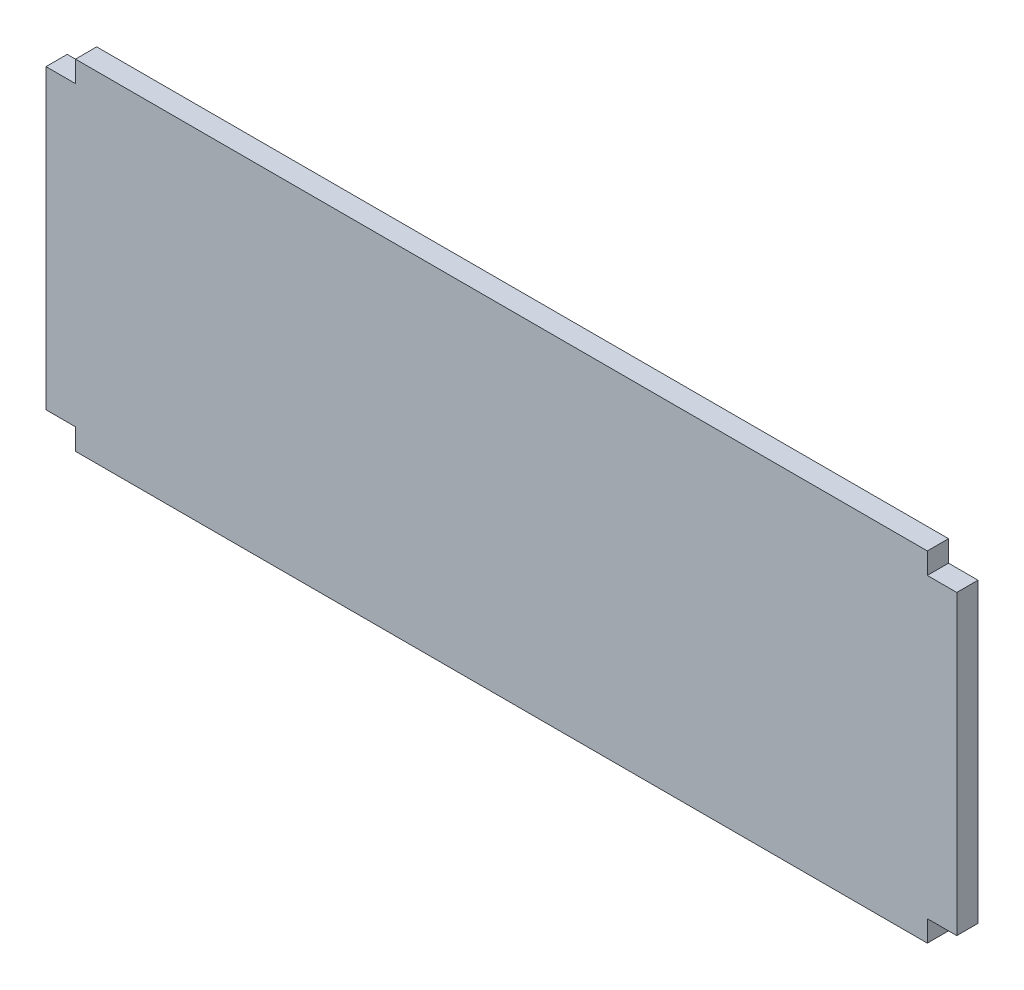
ISO-10303-21;
HEADER;
FILE_DESCRIPTION(('STEP AP214'),'2;1');
FILE_NAME('part.step','',(''),(''),'','','');
FILE_SCHEMA(('AUTOMOTIVE_DESIGN { 1 0 10303 214 1 1 1 1 }'));
ENDSEC;
DATA;
#1=APPLICATION_CONTEXT('core data for automotive mechanical design processes');
#2=APPLICATION_PROTOCOL_DEFINITION('international standard','automotive_design',2000,#1);
#3=PRODUCT_CONTEXT('',#1,'mechanical');
#4=PRODUCT('Part','Part','',(#3));
#5=PRODUCT_RELATED_PRODUCT_CATEGORY('part','',(#4));
#6=PRODUCT_DEFINITION_FORMATION('','',#4);
#7=PRODUCT_DEFINITION_CONTEXT('part definition',#1,'design');
#8=PRODUCT_DEFINITION('design','',#6,#7);
#9=PRODUCT_DEFINITION_SHAPE('','',#8);
#10=(LENGTH_UNIT() NAMED_UNIT(*) SI_UNIT(.MILLI.,.METRE.));
#11=(NAMED_UNIT(*) PLANE_ANGLE_UNIT() SI_UNIT($,.RADIAN.));
#12=(NAMED_UNIT(*) SI_UNIT($,.STERADIAN.) SOLID_ANGLE_UNIT());
#13=UNCERTAINTY_MEASURE_WITH_UNIT(LENGTH_MEASURE(1.E-05),#10,'distance_accuracy_value','');
#14=(GEOMETRIC_REPRESENTATION_CONTEXT(3) GLOBAL_UNCERTAINTY_ASSIGNED_CONTEXT((#13)) GLOBAL_UNIT_ASSIGNED_CONTEXT((#10,
#11,#12)) REPRESENTATION_CONTEXT('',''));
#15=CARTESIAN_POINT('',(0.,0.,0.));
#16=DIRECTION('',(0.,0.,1.));
#17=DIRECTION('',(1.,0.,0.));
#18=AXIS2_PLACEMENT_3D('',#15,#16,#17);
#19=CARTESIAN_POINT('',(49.4442360253456,120.991666867358,5.08));
#20=DIRECTION('',(1.,0.,0.));
#21=DIRECTION('',(0.,0.,-1.));
#22=AXIS2_PLACEMENT_3D('',#19,#20,#21);
#23=PLANE('',#22);
#24=DIRECTION('',(0.,-1.,0.));
#25=VECTOR('',#24,1.);
#26=CARTESIAN_POINT('',(49.4442360253456,120.991666867358,0.));
#27=LINE('',#26,#25);
#28=CARTESIAN_POINT('',(49.4442360253456,120.991666867358,0.));
#29=VERTEX_POINT('',#28);
#30=CARTESIAN_POINT('',(49.4442360253456,115.911666867358,0.));
#31=VERTEX_POINT('',#30);
#32=EDGE_CURVE('E153',#29,#31,#27,.T.);
#33=ORIENTED_EDGE('',*,*,#32,.T.);
#34=DIRECTION('',(0.,0.,-1.));
#35=VECTOR('',#34,1.);
#36=CARTESIAN_POINT('',(49.4442360253456,115.911666867358,5.08));
#37=LINE('',#36,#35);
#38=CARTESIAN_POINT('',(49.4442360253456,115.911666867358,5.08));
#39=VERTEX_POINT('',#38);
#40=EDGE_CURVE('E11',#39,#31,#37,.T.);
#41=ORIENTED_EDGE('',*,*,#40,.F.);
#42=DIRECTION('',(0.,-1.,0.));
#43=VECTOR('',#42,1.);
#44=CARTESIAN_POINT('',(49.4442360253456,120.991666867358,5.08));
#45=LINE('',#44,#43);
#46=CARTESIAN_POINT('',(49.4442360253456,120.991666867358,5.08));
#47=VERTEX_POINT('',#46);
#48=EDGE_CURVE('E183',#47,#39,#45,.T.);
#49=ORIENTED_EDGE('',*,*,#48,.F.);
#50=DIRECTION('',(0.,0.,-1.));
#51=VECTOR('',#50,1.);
#52=CARTESIAN_POINT('',(49.4442360253456,120.991666867358,5.08));
#53=LINE('',#52,#51);
#54=EDGE_CURVE('E49',#47,#29,#53,.T.);
#55=ORIENTED_EDGE('',*,*,#54,.T.);
#56=EDGE_LOOP('',(#33,#41,#49,#55));
#57=FACE_BOUND('',#56,.T.);
#58=ADVANCED_FACE('F33',(#57),#23,.F.);
#59=CARTESIAN_POINT('',(49.4442360253456,115.911666867358,5.08));
#60=DIRECTION('',(0.,-1.,0.));
#61=DIRECTION('',(0.,0.,-1.));
#62=AXIS2_PLACEMENT_3D('',#59,#60,#61);
#63=PLANE('',#62);
#64=DIRECTION('',(-1.,0.,0.));
#65=VECTOR('',#64,1.);
#66=CARTESIAN_POINT('',(49.4442360253456,115.911666867358,0.));
#67=LINE('',#66,#65);
#68=CARTESIAN_POINT('',(42.3963105306768,115.911666867358,0.));
#69=VERTEX_POINT('',#68);
#70=EDGE_CURVE('E155',#31,#69,#67,.T.);
#71=ORIENTED_EDGE('',*,*,#70,.T.);
#72=DIRECTION('',(0.,0.,-1.));
#73=VECTOR('',#72,1.);
#74=CARTESIAN_POINT('',(42.3963105306768,115.911666867358,5.08));
#75=LINE('',#74,#73);
#76=CARTESIAN_POINT('',(42.3963105306768,115.911666867358,5.08));
#77=VERTEX_POINT('',#76);
#78=EDGE_CURVE('E41',#77,#69,#75,.T.);
#79=ORIENTED_EDGE('',*,*,#78,.F.);
#80=DIRECTION('',(-1.,0.,0.));
#81=VECTOR('',#80,1.);
#82=CARTESIAN_POINT('',(49.4442360253456,115.911666867358,5.08));
#83=LINE('',#82,#81);
#84=EDGE_CURVE('E99',#39,#77,#83,.T.);
#85=ORIENTED_EDGE('',*,*,#84,.F.);
#86=ORIENTED_EDGE('',*,*,#40,.T.);
#87=EDGE_LOOP('',(#71,#79,#85,#86));
#88=FACE_BOUND('',#87,.T.);
#89=ADVANCED_FACE('F245',(#88),#63,.F.);
#90=CARTESIAN_POINT('',(42.3963105306768,115.911666867358,5.08));
#91=DIRECTION('',(1.,0.,0.));
#92=DIRECTION('',(0.,0.,-1.));
#93=AXIS2_PLACEMENT_3D('',#90,#91,#92);
#94=PLANE('',#93);
#95=DIRECTION('',(0.,-1.,0.));
#96=VECTOR('',#95,1.);
#97=CARTESIAN_POINT('',(42.3963105306768,115.911666867358,0.));
#98=LINE('',#97,#96);
#99=CARTESIAN_POINT('',(42.3963105306768,44.7916668673583,0.));
#100=VERTEX_POINT('',#99);
#101=EDGE_CURVE('E157',#69,#100,#98,.T.);
#102=ORIENTED_EDGE('',*,*,#101,.T.);
#103=DIRECTION('',(0.,0.,-1.));
#104=VECTOR('',#103,1.);
#105=CARTESIAN_POINT('',(42.3963105306768,44.7916668673583,5.08));
#106=LINE('',#105,#104);
#107=CARTESIAN_POINT('',(42.3963105306768,44.7916668673583,5.08));
#108=VERTEX_POINT('',#107);
#109=EDGE_CURVE('E198',#108,#100,#106,.T.);
#110=ORIENTED_EDGE('',*,*,#109,.F.);
#111=DIRECTION('',(0.,-1.,0.));
#112=VECTOR('',#111,1.);
#113=CARTESIAN_POINT('',(42.3963105306768,115.911666867358,5.08));
#114=LINE('',#113,#112);
#115=EDGE_CURVE('E205',#77,#108,#114,.T.);
#116=ORIENTED_EDGE('',*,*,#115,.F.);
#117=ORIENTED_EDGE('',*,*,#78,.T.);
#118=EDGE_LOOP('',(#102,#110,#116,#117));
#119=FACE_BOUND('',#118,.T.);
#120=ADVANCED_FACE('F203',(#119),#94,.F.);
#121=CARTESIAN_POINT('',(49.4442360253456,44.7916668673583,5.08));
#122=DIRECTION('',(0.,-1.,0.));
#123=DIRECTION('',(0.,0.,-1.));
#124=AXIS2_PLACEMENT_3D('',#121,#122,#123);
#125=PLANE('',#124);
#126=DIRECTION('',(-1.,0.,0.));
#127=VECTOR('',#126,1.);
#128=CARTESIAN_POINT('',(49.4442360253456,44.7916668673583,0.));
#129=LINE('',#128,#127);
#130=CARTESIAN_POINT('',(49.4442360253456,44.7916668673583,0.));
#131=VERTEX_POINT('',#130);
#132=EDGE_CURVE('E160',#131,#100,#129,.T.);
#133=ORIENTED_EDGE('',*,*,#132,.F.);
#134=DIRECTION('',(0.,0.,-1.));
#135=VECTOR('',#134,1.);
#136=CARTESIAN_POINT('',(49.4442360253456,44.7916668673583,5.08));
#137=LINE('',#136,#135);
#138=CARTESIAN_POINT('',(49.4442360253456,44.7916668673583,5.08));
#139=VERTEX_POINT('',#138);
#140=EDGE_CURVE('E196',#139,#131,#137,.T.);
#141=ORIENTED_EDGE('',*,*,#140,.F.);
#142=DIRECTION('',(-1.,0.,0.));
#143=VECTOR('',#142,1.);
#144=CARTESIAN_POINT('',(49.4442360253456,44.7916668673583,5.08));
#145=LINE('',#144,#143);
#146=EDGE_CURVE('E216',#139,#108,#145,.T.);
#147=ORIENTED_EDGE('',*,*,#146,.T.);
#148=ORIENTED_EDGE('',*,*,#109,.T.);
#149=EDGE_LOOP('',(#133,#141,#147,#148));
#150=FACE_BOUND('',#149,.T.);
#151=ADVANCED_FACE('F212',(#150),#125,.T.);
#152=CARTESIAN_POINT('',(49.4442360253456,44.7916668673583,5.08));
#153=DIRECTION('',(1.,0.,0.));
#154=DIRECTION('',(0.,0.,-1.));
#155=AXIS2_PLACEMENT_3D('',#152,#153,#154);
#156=PLANE('',#155);
#157=DIRECTION('',(0.,-1.,0.));
#158=VECTOR('',#157,1.);
#159=CARTESIAN_POINT('',(49.4442360253456,44.7916668673583,0.));
#160=LINE('',#159,#158);
#161=CARTESIAN_POINT('',(49.4442360253456,39.7116668673583,0.));
#162=VERTEX_POINT('',#161);
#163=EDGE_CURVE('E163',#131,#162,#160,.T.);
#164=ORIENTED_EDGE('',*,*,#163,.T.);
#165=DIRECTION('',(0.,0.,-1.));
#166=VECTOR('',#165,1.);
#167=CARTESIAN_POINT('',(49.4442360253456,39.7116668673583,5.08));
#168=LINE('',#167,#166);
#169=CARTESIAN_POINT('',(49.4442360253456,39.7116668673583,5.08));
#170=VERTEX_POINT('',#169);
#171=EDGE_CURVE('E193',#170,#162,#168,.T.);
#172=ORIENTED_EDGE('',*,*,#171,.F.);
#173=DIRECTION('',(0.,-1.,0.));
#174=VECTOR('',#173,1.);
#175=CARTESIAN_POINT('',(49.4442360253456,44.7916668673583,5.08));
#176=LINE('',#175,#174);
#177=EDGE_CURVE('E217',#139,#170,#176,.T.);
#178=ORIENTED_EDGE('',*,*,#177,.F.);
#179=ORIENTED_EDGE('',*,*,#140,.T.);
#180=EDGE_LOOP('',(#164,#172,#178,#179));
#181=FACE_BOUND('',#180,.T.);
#182=ADVANCED_FACE('F258',(#181),#156,.F.);
#183=CARTESIAN_POINT('',(49.4442360253456,39.7116668673583,5.08));
#184=DIRECTION('',(0.,1.,0.));
#185=DIRECTION('',(0.,0.,1.));
#186=AXIS2_PLACEMENT_3D('',#183,#184,#185);
#187=PLANE('',#186);
#188=DIRECTION('',(1.,0.,0.));
#189=VECTOR('',#188,1.);
#190=CARTESIAN_POINT('',(49.4442360253456,39.7116668673583,0.));
#191=LINE('',#190,#189);
#192=CARTESIAN_POINT('',(253.279004245575,39.7116668673583,0.));
#193=VERTEX_POINT('',#192);
#194=EDGE_CURVE('E165',#162,#193,#191,.T.);
#195=ORIENTED_EDGE('',*,*,#194,.T.);
#196=DIRECTION('',(0.,0.,-1.));
#197=VECTOR('',#196,1.);
#198=CARTESIAN_POINT('',(253.279004245575,39.7116668673583,5.08));
#199=LINE('',#198,#197);
#200=CARTESIAN_POINT('',(253.279004245575,39.7116668673583,5.08));
#201=VERTEX_POINT('',#200);
#202=EDGE_CURVE('E191',#201,#193,#199,.T.);
#203=ORIENTED_EDGE('',*,*,#202,.F.);
#204=DIRECTION('',(1.,0.,0.));
#205=VECTOR('',#204,1.);
#206=CARTESIAN_POINT('',(49.4442360253456,39.7116668673583,5.08));
#207=LINE('',#206,#205);
#208=EDGE_CURVE('E219',#170,#201,#207,.T.);
#209=ORIENTED_EDGE('',*,*,#208,.F.);
#210=ORIENTED_EDGE('',*,*,#171,.T.);
#211=EDGE_LOOP('',(#195,#203,#209,#210));
#212=FACE_BOUND('',#211,.T.);
#213=ADVANCED_FACE('F261',(#212),#187,.F.);
#214=CARTESIAN_POINT('',(253.279004245575,44.7916668673583,5.08));
#215=DIRECTION('',(1.,0.,0.));
#216=DIRECTION('',(0.,0.,-1.));
#217=AXIS2_PLACEMENT_3D('',#214,#215,#216);
#218=PLANE('',#217);
#219=DIRECTION('',(0.,-1.,0.));
#220=VECTOR('',#219,1.);
#221=CARTESIAN_POINT('',(253.279004245575,44.7916668673583,0.));
#222=LINE('',#221,#220);
#223=CARTESIAN_POINT('',(253.279004245575,44.7916668673583,0.));
#224=VERTEX_POINT('',#223);
#225=EDGE_CURVE('E168',#224,#193,#222,.T.);
#226=ORIENTED_EDGE('',*,*,#225,.F.);
#227=DIRECTION('',(0.,0.,-1.));
#228=VECTOR('',#227,1.);
#229=CARTESIAN_POINT('',(253.279004245575,44.7916668673583,5.08));
#230=LINE('',#229,#228);
#231=CARTESIAN_POINT('',(253.279004245575,44.7916668673583,5.08));
#232=VERTEX_POINT('',#231);
#233=EDGE_CURVE('E189',#232,#224,#230,.T.);
#234=ORIENTED_EDGE('',*,*,#233,.F.);
#235=DIRECTION('',(0.,-1.,0.));
#236=VECTOR('',#235,1.);
#237=CARTESIAN_POINT('',(253.279004245575,44.7916668673583,5.08));
#238=LINE('',#237,#236);
#239=EDGE_CURVE('E225',#232,#201,#238,.T.);
#240=ORIENTED_EDGE('',*,*,#239,.T.);
#241=ORIENTED_EDGE('',*,*,#202,.T.);
#242=EDGE_LOOP('',(#226,#234,#240,#241));
#243=FACE_BOUND('',#242,.T.);
#244=ADVANCED_FACE('F265',(#243),#218,.T.);
#245=CARTESIAN_POINT('',(253.279004245575,44.7916668673583,5.08));
#246=DIRECTION('',(0.,1.,0.));
#247=DIRECTION('',(0.,0.,1.));
#248=AXIS2_PLACEMENT_3D('',#245,#246,#247);
#249=PLANE('',#248);
#250=DIRECTION('',(1.,0.,0.));
#251=VECTOR('',#250,1.);
#252=CARTESIAN_POINT('',(253.279004245575,44.7916668673583,0.));
#253=LINE('',#252,#251);
#254=CARTESIAN_POINT('',(260.326929740244,44.7916668673583,0.));
#255=VERTEX_POINT('',#254);
#256=EDGE_CURVE('E171',#224,#255,#253,.T.);
#257=ORIENTED_EDGE('',*,*,#256,.T.);
#258=DIRECTION('',(0.,0.,-1.));
#259=VECTOR('',#258,1.);
#260=CARTESIAN_POINT('',(260.326929740244,44.7916668673583,5.08));
#261=LINE('',#260,#259);
#262=CARTESIAN_POINT('',(260.326929740244,44.7916668673583,5.08));
#263=VERTEX_POINT('',#262);
#264=EDGE_CURVE('E187',#263,#255,#261,.T.);
#265=ORIENTED_EDGE('',*,*,#264,.F.);
#266=DIRECTION('',(1.,0.,0.));
#267=VECTOR('',#266,1.);
#268=CARTESIAN_POINT('',(253.279004245575,44.7916668673583,5.08));
#269=LINE('',#268,#267);
#270=EDGE_CURVE('E228',#232,#263,#269,.T.);
#271=ORIENTED_EDGE('',*,*,#270,.F.);
#272=ORIENTED_EDGE('',*,*,#233,.T.);
#273=EDGE_LOOP('',(#257,#265,#271,#272));
#274=FACE_BOUND('',#273,.T.);
#275=ADVANCED_FACE('F269',(#274),#249,.F.);
#276=CARTESIAN_POINT('',(260.326929740244,115.911666867358,5.08));
#277=DIRECTION('',(1.,0.,0.));
#278=DIRECTION('',(0.,0.,-1.));
#279=AXIS2_PLACEMENT_3D('',#276,#277,#278);
#280=PLANE('',#279);
#281=DIRECTION('',(0.,-1.,0.));
#282=VECTOR('',#281,1.);
#283=CARTESIAN_POINT('',(260.326929740244,115.911666867358,0.));
#284=LINE('',#283,#282);
#285=CARTESIAN_POINT('',(260.326929740244,115.911666867358,0.));
#286=VERTEX_POINT('',#285);
#287=EDGE_CURVE('E174',#286,#255,#284,.T.);
#288=ORIENTED_EDGE('',*,*,#287,.F.);
#289=DIRECTION('',(0.,0.,-1.));
#290=VECTOR('',#289,1.);
#291=CARTESIAN_POINT('',(260.326929740244,115.911666867358,5.08));
#292=LINE('',#291,#290);
#293=CARTESIAN_POINT('',(260.326929740244,115.911666867358,5.08));
#294=VERTEX_POINT('',#293);
#295=EDGE_CURVE('E136',#294,#286,#292,.T.);
#296=ORIENTED_EDGE('',*,*,#295,.F.);
#297=DIRECTION('',(0.,-1.,0.));
#298=VECTOR('',#297,1.);
#299=CARTESIAN_POINT('',(260.326929740244,115.911666867358,5.08));
#300=LINE('',#299,#298);
#301=EDGE_CURVE('E145',#294,#263,#300,.T.);
#302=ORIENTED_EDGE('',*,*,#301,.T.);
#303=ORIENTED_EDGE('',*,*,#264,.T.);
#304=EDGE_LOOP('',(#288,#296,#302,#303));
#305=FACE_BOUND('',#304,.T.);
#306=ADVANCED_FACE('F231',(#305),#280,.T.);
#307=CARTESIAN_POINT('',(253.279004245575,115.911666867358,5.08));
#308=DIRECTION('',(0.,1.,0.));
#309=DIRECTION('',(0.,0.,1.));
#310=AXIS2_PLACEMENT_3D('',#307,#308,#309);
#311=PLANE('',#310);
#312=DIRECTION('',(1.,0.,0.));
#313=VECTOR('',#312,1.);
#314=CARTESIAN_POINT('',(253.279004245575,115.911666867358,0.));
#315=LINE('',#314,#313);
#316=CARTESIAN_POINT('',(253.279004245575,115.911666867358,0.));
#317=VERTEX_POINT('',#316);
#318=EDGE_CURVE('E132',#317,#286,#315,.T.);
#319=ORIENTED_EDGE('',*,*,#318,.F.);
#320=DIRECTION('',(0.,0.,-1.));
#321=VECTOR('',#320,1.);
#322=CARTESIAN_POINT('',(253.279004245575,115.911666867358,5.08));
#323=LINE('',#322,#321);
#324=CARTESIAN_POINT('',(253.279004245575,115.911666867358,5.08));
#325=VERTEX_POINT('',#324);
#326=EDGE_CURVE('E127',#325,#317,#323,.T.);
#327=ORIENTED_EDGE('',*,*,#326,.F.);
#328=DIRECTION('',(1.,0.,0.));
#329=VECTOR('',#328,1.);
#330=CARTESIAN_POINT('',(253.279004245575,115.911666867358,5.08));
#331=LINE('',#330,#329);
#332=EDGE_CURVE('E130',#325,#294,#331,.T.);
#333=ORIENTED_EDGE('',*,*,#332,.T.);
#334=ORIENTED_EDGE('',*,*,#295,.T.);
#335=EDGE_LOOP('',(#319,#327,#333,#334));
#336=FACE_BOUND('',#335,.T.);
#337=ADVANCED_FACE('F129',(#336),#311,.T.);
#338=CARTESIAN_POINT('',(253.279004245575,120.991666867358,5.08));
#339=DIRECTION('',(1.,0.,0.));
#340=DIRECTION('',(0.,0.,-1.));
#341=AXIS2_PLACEMENT_3D('',#338,#339,#340);
#342=PLANE('',#341);
#343=DIRECTION('',(0.,-1.,0.));
#344=VECTOR('',#343,1.);
#345=CARTESIAN_POINT('',(253.279004245575,120.991666867358,0.));
#346=LINE('',#345,#344);
#347=CARTESIAN_POINT('',(253.279004245575,120.991666867358,0.));
#348=VERTEX_POINT('',#347);
#349=EDGE_CURVE('E178',#348,#317,#346,.T.);
#350=ORIENTED_EDGE('',*,*,#349,.F.);
#351=DIRECTION('',(0.,0.,-1.));
#352=VECTOR('',#351,1.);
#353=CARTESIAN_POINT('',(253.279004245575,120.991666867358,5.08));
#354=LINE('',#353,#352);
#355=CARTESIAN_POINT('',(253.279004245575,120.991666867358,5.08));
#356=VERTEX_POINT('',#355);
#357=EDGE_CURVE('E87',#356,#348,#354,.T.);
#358=ORIENTED_EDGE('',*,*,#357,.F.);
#359=DIRECTION('',(0.,-1.,0.));
#360=VECTOR('',#359,1.);
#361=CARTESIAN_POINT('',(253.279004245575,120.991666867358,5.08));
#362=LINE('',#361,#360);
#363=EDGE_CURVE('E143',#356,#325,#362,.T.);
#364=ORIENTED_EDGE('',*,*,#363,.T.);
#365=ORIENTED_EDGE('',*,*,#326,.T.);
#366=EDGE_LOOP('',(#350,#358,#364,#365));
#367=FACE_BOUND('',#366,.T.);
#368=ADVANCED_FACE('F147',(#367),#342,.T.);
#369=CARTESIAN_POINT('',(49.4442360253456,120.991666867358,5.08));
#370=DIRECTION('',(0.,1.,0.));
#371=DIRECTION('',(0.,0.,1.));
#372=AXIS2_PLACEMENT_3D('',#369,#370,#371);
#373=PLANE('',#372);
#374=DIRECTION('',(1.,0.,0.));
#375=VECTOR('',#374,1.);
#376=CARTESIAN_POINT('',(49.4442360253456,120.991666867358,0.));
#377=LINE('',#376,#375);
#378=EDGE_CURVE('E180',#29,#348,#377,.T.);
#379=ORIENTED_EDGE('',*,*,#378,.F.);
#380=ORIENTED_EDGE('',*,*,#54,.F.);
#381=DIRECTION('',(1.,0.,0.));
#382=VECTOR('',#381,1.);
#383=CARTESIAN_POINT('',(49.4442360253456,120.991666867358,5.08));
#384=LINE('',#383,#382);
#385=EDGE_CURVE('E148',#47,#356,#384,.T.);
#386=ORIENTED_EDGE('',*,*,#385,.T.);
#387=ORIENTED_EDGE('',*,*,#357,.T.);
#388=EDGE_LOOP('',(#379,#380,#386,#387));
#389=FACE_BOUND('',#388,.T.);
#390=ADVANCED_FACE('F234',(#389),#373,.T.);
#391=CARTESIAN_POINT('',(0.,0.,5.08));
#392=DIRECTION('',(0.,0.,-1.));
#393=DIRECTION('',(-1.,0.,0.));
#394=AXIS2_PLACEMENT_3D('',#391,#392,#393);
#395=PLANE('',#394);
#396=ORIENTED_EDGE('',*,*,#48,.T.);
#397=ORIENTED_EDGE('',*,*,#84,.T.);
#398=ORIENTED_EDGE('',*,*,#115,.T.);
#399=ORIENTED_EDGE('',*,*,#146,.F.);
#400=ORIENTED_EDGE('',*,*,#177,.T.);
#401=ORIENTED_EDGE('',*,*,#208,.T.);
#402=ORIENTED_EDGE('',*,*,#239,.F.);
#403=ORIENTED_EDGE('',*,*,#270,.T.);
#404=ORIENTED_EDGE('',*,*,#301,.F.);
#405=ORIENTED_EDGE('',*,*,#332,.F.);
#406=ORIENTED_EDGE('',*,*,#363,.F.);
#407=ORIENTED_EDGE('',*,*,#385,.F.);
#408=EDGE_LOOP('',(#396,#397,#398,#399,#400,#401,#402,#403,#404,#405,#406,#407));
#409=FACE_BOUND('',#408,.T.);
#410=ADVANCED_FACE('F141',(#409),#395,.F.);
#411=CARTESIAN_POINT('',(0.,0.,0.));
#412=DIRECTION('',(0.,0.,-1.));
#413=DIRECTION('',(-1.,0.,0.));
#414=AXIS2_PLACEMENT_3D('',#411,#412,#413);
#415=PLANE('',#414);
#416=ORIENTED_EDGE('',*,*,#32,.F.);
#417=ORIENTED_EDGE('',*,*,#378,.T.);
#418=ORIENTED_EDGE('',*,*,#349,.T.);
#419=ORIENTED_EDGE('',*,*,#318,.T.);
#420=ORIENTED_EDGE('',*,*,#287,.T.);
#421=ORIENTED_EDGE('',*,*,#256,.F.);
#422=ORIENTED_EDGE('',*,*,#225,.T.);
#423=ORIENTED_EDGE('',*,*,#194,.F.);
#424=ORIENTED_EDGE('',*,*,#163,.F.);
#425=ORIENTED_EDGE('',*,*,#132,.T.);
#426=ORIENTED_EDGE('',*,*,#101,.F.);
#427=ORIENTED_EDGE('',*,*,#70,.F.);
#428=EDGE_LOOP('',(#416,#417,#418,#419,#420,#421,#422,#423,#424,#425,#426,#427));
#429=FACE_BOUND('',#428,.T.);
#430=ADVANCED_FACE('F207',(#429),#415,.T.);
#431=CLOSED_SHELL('',(#58,#89,#120,#151,#182,#213,#244,#275,#306,#337,#368,#390,#410,#430));
#432=MANIFOLD_SOLID_BREP('B2',#431);
#433=ADVANCED_BREP_SHAPE_REPRESENTATION('',(#18,#432),#14);
#434=SHAPE_DEFINITION_REPRESENTATION(#9,#433);
ENDSEC;
END-ISO-10303-21;
